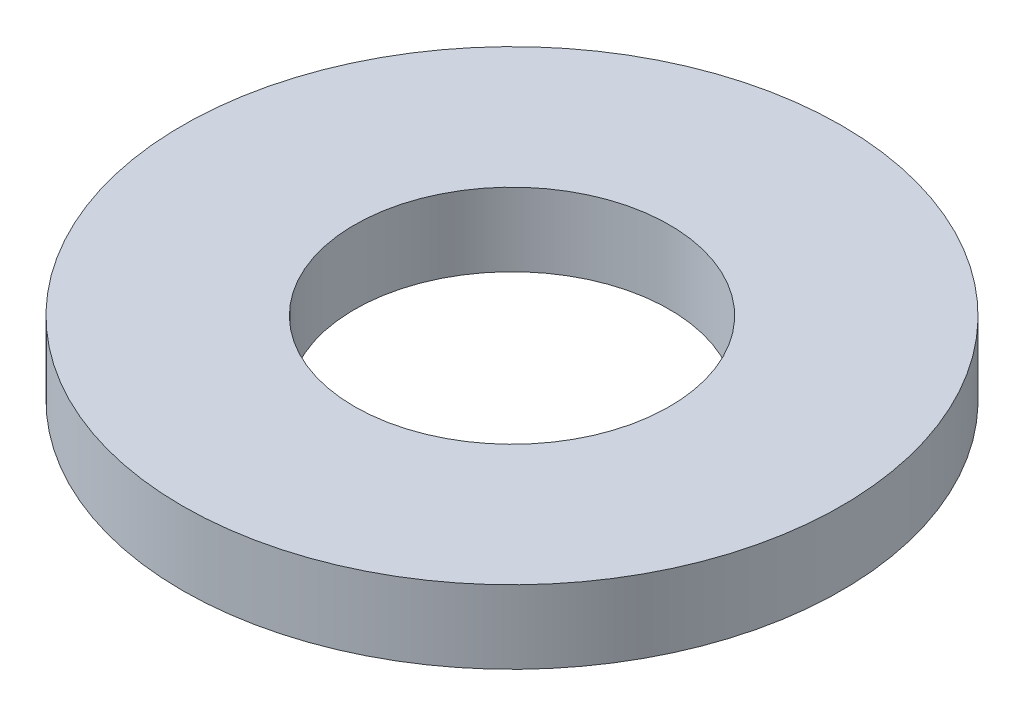
ISO-10303-21;
HEADER;
FILE_DESCRIPTION(('STEP AP214'),'2;1');
FILE_NAME('part.step','',(''),(''),'','','');
FILE_SCHEMA(('AUTOMOTIVE_DESIGN { 1 0 10303 214 1 1 1 1 }'));
ENDSEC;
DATA;
#1=APPLICATION_CONTEXT('core data for automotive mechanical design processes');
#2=APPLICATION_PROTOCOL_DEFINITION('international standard','automotive_design',2000,#1);
#3=PRODUCT_CONTEXT('',#1,'mechanical');
#4=PRODUCT('Part','Part','',(#3));
#5=PRODUCT_RELATED_PRODUCT_CATEGORY('part','',(#4));
#6=PRODUCT_DEFINITION_FORMATION('','',#4);
#7=PRODUCT_DEFINITION_CONTEXT('part definition',#1,'design');
#8=PRODUCT_DEFINITION('design','',#6,#7);
#9=PRODUCT_DEFINITION_SHAPE('','',#8);
#10=(LENGTH_UNIT() NAMED_UNIT(*) SI_UNIT(.MILLI.,.METRE.));
#11=(NAMED_UNIT(*) PLANE_ANGLE_UNIT() SI_UNIT($,.RADIAN.));
#12=(NAMED_UNIT(*) SI_UNIT($,.STERADIAN.) SOLID_ANGLE_UNIT());
#13=UNCERTAINTY_MEASURE_WITH_UNIT(LENGTH_MEASURE(1.E-05),#10,'distance_accuracy_value','');
#14=(GEOMETRIC_REPRESENTATION_CONTEXT(3) GLOBAL_UNCERTAINTY_ASSIGNED_CONTEXT((#13)) GLOBAL_UNIT_ASSIGNED_CONTEXT((#10,
#11,#12)) REPRESENTATION_CONTEXT('',''));
#15=CARTESIAN_POINT('',(0.,0.,0.));
#16=DIRECTION('',(0.,0.,1.));
#17=DIRECTION('',(1.,0.,0.));
#18=AXIS2_PLACEMENT_3D('',#15,#16,#17);
#19=CARTESIAN_POINT('',(0.,1.,0.));
#20=DIRECTION('',(0.,1.,0.));
#21=DIRECTION('',(0.,0.,1.));
#22=AXIS2_PLACEMENT_3D('',#19,#20,#21);
#23=PLANE('',#22);
#24=CARTESIAN_POINT('',(0.,1.,0.));
#25=DIRECTION('',(0.,1.,0.));
#26=DIRECTION('',(0.,0.,1.));
#27=AXIS2_PLACEMENT_3D('',#24,#25,#26);
#28=CIRCLE('',#27,4.5);
#29=CARTESIAN_POINT('',(0.,1.,4.5));
#30=VERTEX_POINT('',#29);
#31=EDGE_CURVE('E10',#30,#30,#28,.T.);
#32=ORIENTED_EDGE('',*,*,#31,.T.);
#33=EDGE_LOOP('',(#32));
#34=FACE_BOUND('',#33,.T.);
#35=CARTESIAN_POINT('',(0.,1.,0.));
#36=DIRECTION('',(0.,1.,0.));
#37=DIRECTION('',(0.,0.,1.));
#38=AXIS2_PLACEMENT_3D('',#35,#36,#37);
#39=CIRCLE('',#38,2.15);
#40=CARTESIAN_POINT('',(0.,1.,2.15));
#41=VERTEX_POINT('',#40);
#42=EDGE_CURVE('E56',#41,#41,#39,.T.);
#43=ORIENTED_EDGE('',*,*,#42,.F.);
#44=EDGE_LOOP('',(#43));
#45=FACE_BOUND('',#44,.T.);
#46=ADVANCED_FACE('F43',(#34,#45),#23,.T.);
#47=CARTESIAN_POINT('',(0.,0.,0.));
#48=DIRECTION('',(0.,1.,0.));
#49=DIRECTION('',(0.,0.,1.));
#50=AXIS2_PLACEMENT_3D('',#47,#48,#49);
#51=PLANE('',#50);
#52=CARTESIAN_POINT('',(0.,0.,0.));
#53=DIRECTION('',(0.,1.,0.));
#54=DIRECTION('',(0.,0.,1.));
#55=AXIS2_PLACEMENT_3D('',#52,#53,#54);
#56=CIRCLE('',#55,4.5);
#57=CARTESIAN_POINT('',(0.,0.,4.5));
#58=VERTEX_POINT('',#57);
#59=EDGE_CURVE('E47',#58,#58,#56,.T.);
#60=ORIENTED_EDGE('',*,*,#59,.F.);
#61=EDGE_LOOP('',(#60));
#62=FACE_BOUND('',#61,.T.);
#63=CARTESIAN_POINT('',(0.,0.,0.));
#64=DIRECTION('',(0.,1.,0.));
#65=DIRECTION('',(0.,0.,1.));
#66=AXIS2_PLACEMENT_3D('',#63,#64,#65);
#67=CIRCLE('',#66,2.15);
#68=CARTESIAN_POINT('',(0.,0.,2.15));
#69=VERTEX_POINT('',#68);
#70=EDGE_CURVE('E58',#69,#69,#67,.T.);
#71=ORIENTED_EDGE('',*,*,#70,.T.);
#72=EDGE_LOOP('',(#71));
#73=FACE_BOUND('',#72,.T.);
#74=ADVANCED_FACE('F70',(#62,#73),#51,.F.);
#75=CARTESIAN_POINT('',(0.,1.,0.));
#76=DIRECTION('',(0.,-1.,0.));
#77=DIRECTION('',(0.,0.,-1.));
#78=AXIS2_PLACEMENT_3D('',#75,#76,#77);
#79=CYLINDRICAL_SURFACE('',#78,4.5);
#80=ORIENTED_EDGE('',*,*,#31,.F.);
#81=EDGE_LOOP('',(#80));
#82=FACE_BOUND('',#81,.T.);
#83=ORIENTED_EDGE('',*,*,#59,.T.);
#84=EDGE_LOOP('',(#83));
#85=FACE_BOUND('',#84,.T.);
#86=ADVANCED_FACE('F45',(#82,#85),#79,.T.);
#87=CARTESIAN_POINT('',(0.,1.,0.));
#88=DIRECTION('',(0.,-1.,0.));
#89=DIRECTION('',(0.,0.,-1.));
#90=AXIS2_PLACEMENT_3D('',#87,#88,#89);
#91=CYLINDRICAL_SURFACE('',#90,2.15);
#92=ORIENTED_EDGE('',*,*,#42,.T.);
#93=EDGE_LOOP('',(#92));
#94=FACE_BOUND('',#93,.T.);
#95=ORIENTED_EDGE('',*,*,#70,.F.);
#96=EDGE_LOOP('',(#95));
#97=FACE_BOUND('',#96,.T.);
#98=ADVANCED_FACE('F66',(#94,#97),#91,.F.);
#99=CLOSED_SHELL('',(#46,#74,#86,#98));
#100=MANIFOLD_SOLID_BREP('B2',#99);
#101=ADVANCED_BREP_SHAPE_REPRESENTATION('',(#18,#100),#14);
#102=SHAPE_DEFINITION_REPRESENTATION(#9,#101);
ENDSEC;
END-ISO-10303-21;
